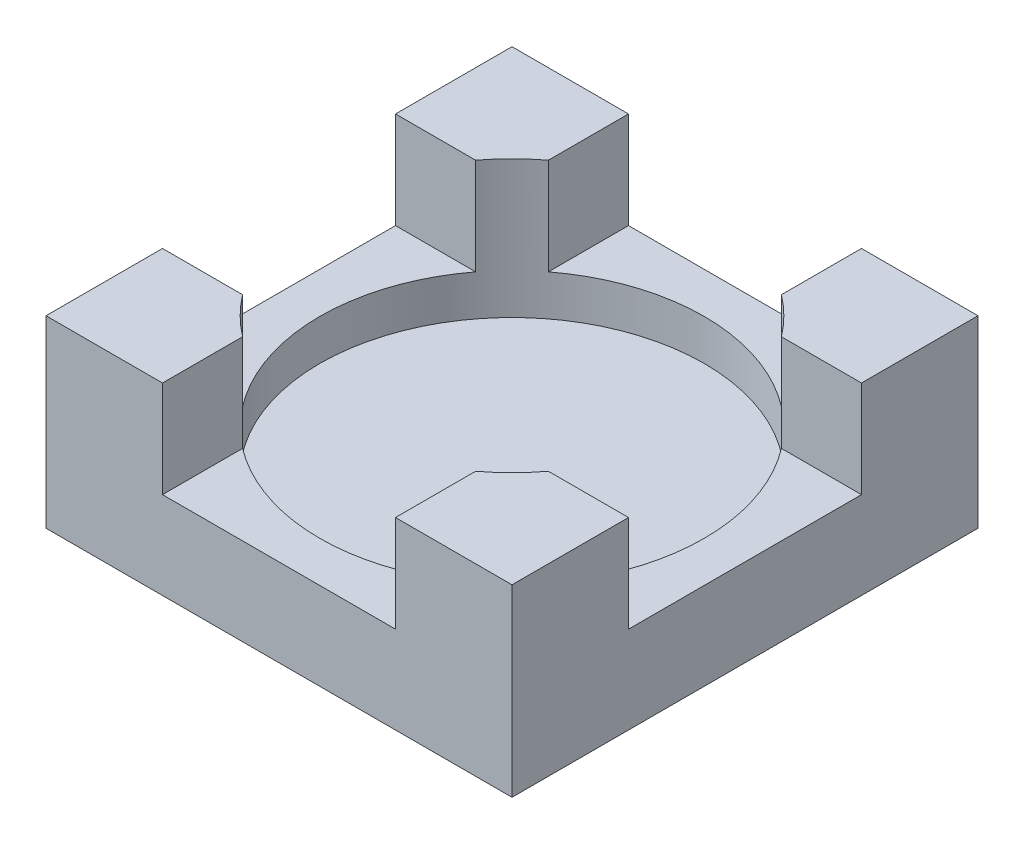
ISO-10303-21;
HEADER;
FILE_DESCRIPTION(('STEP AP214'),'2;1');
FILE_NAME('part.step','',(''),(''),'','','');
FILE_SCHEMA(('AUTOMOTIVE_DESIGN { 1 0 10303 214 1 1 1 1 }'));
ENDSEC;
DATA;
#1=APPLICATION_CONTEXT('core data for automotive mechanical design processes');
#2=APPLICATION_PROTOCOL_DEFINITION('international standard','automotive_design',2000,#1);
#3=PRODUCT_CONTEXT('',#1,'mechanical');
#4=PRODUCT('Part','Part','',(#3));
#5=PRODUCT_RELATED_PRODUCT_CATEGORY('part','',(#4));
#6=PRODUCT_DEFINITION_FORMATION('','',#4);
#7=PRODUCT_DEFINITION_CONTEXT('part definition',#1,'design');
#8=PRODUCT_DEFINITION('design','',#6,#7);
#9=PRODUCT_DEFINITION_SHAPE('','',#8);
#10=(LENGTH_UNIT() NAMED_UNIT(*) SI_UNIT(.MILLI.,.METRE.));
#11=(NAMED_UNIT(*) PLANE_ANGLE_UNIT() SI_UNIT($,.RADIAN.));
#12=(NAMED_UNIT(*) SI_UNIT($,.STERADIAN.) SOLID_ANGLE_UNIT());
#13=UNCERTAINTY_MEASURE_WITH_UNIT(LENGTH_MEASURE(1.E-05),#10,'distance_accuracy_value','');
#14=(GEOMETRIC_REPRESENTATION_CONTEXT(3) GLOBAL_UNCERTAINTY_ASSIGNED_CONTEXT((#13)) GLOBAL_UNIT_ASSIGNED_CONTEXT((#10,
#11,#12)) REPRESENTATION_CONTEXT('',''));
#15=CARTESIAN_POINT('',(0.,0.,0.));
#16=DIRECTION('',(0.,0.,1.));
#17=DIRECTION('',(1.,0.,0.));
#18=AXIS2_PLACEMENT_3D('',#15,#16,#17);
#19=CARTESIAN_POINT('',(0.,4.,0.));
#20=DIRECTION('',(0.,1.,0.));
#21=DIRECTION('',(0.,0.,1.));
#22=AXIS2_PLACEMENT_3D('',#19,#20,#21);
#23=CYLINDRICAL_SURFACE('',#22,16.5);
#24=DIRECTION('',(0.,1.,0.));
#25=VECTOR('',#24,1.);
#26=CARTESIAN_POINT('',(-10.,4.,-13.1244047484067));
#27=LINE('',#26,#25);
#28=CARTESIAN_POINT('',(-10.,15.8,-13.1244047484067));
#29=VERTEX_POINT('',#28);
#30=CARTESIAN_POINT('',(-10.,7.5,-13.1244047484067));
#31=VERTEX_POINT('',#30);
#32=EDGE_CURVE('E249',#29,#31,#27,.F.);
#33=ORIENTED_EDGE('',*,*,#32,.F.);
#34=CARTESIAN_POINT('',(0.,15.8,0.));
#35=DIRECTION('',(0.,-1.,0.));
#36=DIRECTION('',(0.,0.,-1.));
#37=AXIS2_PLACEMENT_3D('',#34,#35,#36);
#38=CIRCLE('',#37,16.5);
#39=CARTESIAN_POINT('',(-13.1244047484067,15.8,-10.));
#40=VERTEX_POINT('',#39);
#41=EDGE_CURVE('E365',#29,#40,#38,.F.);
#42=ORIENTED_EDGE('',*,*,#41,.T.);
#43=DIRECTION('',(0.,1.,0.));
#44=VECTOR('',#43,1.);
#45=CARTESIAN_POINT('',(-13.1244047484067,4.,-10.));
#46=LINE('',#45,#44);
#47=CARTESIAN_POINT('',(-13.1244047484067,7.5,-10.));
#48=VERTEX_POINT('',#47);
#49=EDGE_CURVE('E304',#48,#40,#46,.T.);
#50=ORIENTED_EDGE('',*,*,#49,.F.);
#51=CARTESIAN_POINT('',(0.,7.5,0.));
#52=DIRECTION('',(0.,-1.,0.));
#53=DIRECTION('',(0.,0.,-1.));
#54=AXIS2_PLACEMENT_3D('',#51,#52,#53);
#55=CIRCLE('',#54,16.5);
#56=CARTESIAN_POINT('',(-13.1244047484067,7.5,10.));
#57=VERTEX_POINT('',#56);
#58=EDGE_CURVE('E296',#48,#57,#55,.F.);
#59=ORIENTED_EDGE('',*,*,#58,.T.);
#60=DIRECTION('',(0.,1.,0.));
#61=VECTOR('',#60,1.);
#62=CARTESIAN_POINT('',(-13.1244047484067,4.,10.));
#63=LINE('',#62,#61);
#64=CARTESIAN_POINT('',(-13.1244047484067,15.8,10.));
#65=VERTEX_POINT('',#64);
#66=EDGE_CURVE('E292',#57,#65,#63,.T.);
#67=ORIENTED_EDGE('',*,*,#66,.T.);
#68=CARTESIAN_POINT('',(-10.,15.8,13.1244047484067));
#69=VERTEX_POINT('',#68);
#70=EDGE_CURVE('E358',#65,#69,#38,.F.);
#71=ORIENTED_EDGE('',*,*,#70,.T.);
#72=DIRECTION('',(0.,1.,0.));
#73=VECTOR('',#72,1.);
#74=CARTESIAN_POINT('',(-10.,4.,13.1244047484067));
#75=LINE('',#74,#73);
#76=CARTESIAN_POINT('',(-10.,7.5,13.1244047484067));
#77=VERTEX_POINT('',#76);
#78=EDGE_CURVE('E252',#77,#69,#75,.T.);
#79=ORIENTED_EDGE('',*,*,#78,.F.);
#80=CARTESIAN_POINT('',(0.,7.5,0.));
#81=DIRECTION('',(0.,-1.,0.));
#82=DIRECTION('',(1.,0.,0.));
#83=AXIS2_PLACEMENT_3D('',#80,#81,#82);
#84=CIRCLE('',#83,16.5);
#85=CARTESIAN_POINT('',(10.,7.5,13.1244047484067));
#86=VERTEX_POINT('',#85);
#87=EDGE_CURVE('E245',#77,#86,#84,.F.);
#88=ORIENTED_EDGE('',*,*,#87,.T.);
#89=DIRECTION('',(0.,1.,0.));
#90=VECTOR('',#89,1.);
#91=CARTESIAN_POINT('',(10.,4.,13.1244047484067));
#92=LINE('',#91,#90);
#93=CARTESIAN_POINT('',(10.,15.8,13.1244047484067));
#94=VERTEX_POINT('',#93);
#95=EDGE_CURVE('E240',#86,#94,#92,.T.);
#96=ORIENTED_EDGE('',*,*,#95,.T.);
#97=CARTESIAN_POINT('',(13.1244047484067,15.8,10.));
#98=VERTEX_POINT('',#97);
#99=EDGE_CURVE('E351',#94,#98,#38,.F.);
#100=ORIENTED_EDGE('',*,*,#99,.T.);
#101=DIRECTION('',(0.,1.,0.));
#102=VECTOR('',#101,1.);
#103=CARTESIAN_POINT('',(13.1244047484067,4.,10.));
#104=LINE('',#103,#102);
#105=CARTESIAN_POINT('',(13.1244047484067,7.5,10.));
#106=VERTEX_POINT('',#105);
#107=EDGE_CURVE('E279',#98,#106,#104,.F.);
#108=ORIENTED_EDGE('',*,*,#107,.T.);
#109=CARTESIAN_POINT('',(13.1244047484067,7.5,-10.));
#110=VERTEX_POINT('',#109);
#111=EDGE_CURVE('E297',#106,#110,#55,.F.);
#112=ORIENTED_EDGE('',*,*,#111,.T.);
#113=DIRECTION('',(0.,1.,0.));
#114=VECTOR('',#113,1.);
#115=CARTESIAN_POINT('',(13.1244047484067,4.,-10.));
#116=LINE('',#115,#114);
#117=CARTESIAN_POINT('',(13.1244047484067,15.8,-10.));
#118=VERTEX_POINT('',#117);
#119=EDGE_CURVE('E301',#118,#110,#116,.F.);
#120=ORIENTED_EDGE('',*,*,#119,.F.);
#121=CARTESIAN_POINT('',(10.,15.8,-13.1244047484067));
#122=VERTEX_POINT('',#121);
#123=EDGE_CURVE('E59',#118,#122,#38,.F.);
#124=ORIENTED_EDGE('',*,*,#123,.T.);
#125=DIRECTION('',(0.,1.,0.));
#126=VECTOR('',#125,1.);
#127=CARTESIAN_POINT('',(10.,4.,-13.1244047484067));
#128=LINE('',#127,#126);
#129=CARTESIAN_POINT('',(10.,7.5,-13.1244047484067));
#130=VERTEX_POINT('',#129);
#131=EDGE_CURVE('E237',#122,#130,#128,.F.);
#132=ORIENTED_EDGE('',*,*,#131,.T.);
#133=EDGE_CURVE('E244',#130,#31,#84,.F.);
#134=ORIENTED_EDGE('',*,*,#133,.T.);
#135=EDGE_LOOP('',(#33,#42,#50,#59,#67,#71,#79,#88,#96,#100,#108,#112,#120,#124,#132,#134));
#136=FACE_BOUND('',#135,.T.);
#137=CARTESIAN_POINT('',(0.,4.,0.));
#138=DIRECTION('',(0.,1.,0.));
#139=DIRECTION('',(0.,0.,1.));
#140=AXIS2_PLACEMENT_3D('',#137,#138,#139);
#141=CIRCLE('',#140,16.5);
#142=CARTESIAN_POINT('',(0.,4.,16.5));
#143=VERTEX_POINT('',#142);
#144=EDGE_CURVE('E233',#143,#143,#141,.T.);
#145=ORIENTED_EDGE('',*,*,#144,.F.);
#146=EDGE_LOOP('',(#145));
#147=FACE_BOUND('',#146,.T.);
#148=ADVANCED_FACE('F43',(#136,#147),#23,.F.);
#149=CARTESIAN_POINT('',(-20.,90.,20.));
#150=DIRECTION('',(1.,0.,0.));
#151=DIRECTION('',(0.,0.,-1.));
#152=AXIS2_PLACEMENT_3D('',#149,#150,#151);
#153=PLANE('',#152);
#154=DIRECTION('',(0.,-1.,0.));
#155=VECTOR('',#154,1.);
#156=CARTESIAN_POINT('',(-20.,90.,20.));
#157=LINE('',#156,#155);
#158=CARTESIAN_POINT('',(-20.0000000000001,15.8,20.));
#159=VERTEX_POINT('',#158);
#160=CARTESIAN_POINT('',(-20.,0.,20.));
#161=VERTEX_POINT('',#160);
#162=EDGE_CURVE('E211',#159,#161,#157,.T.);
#163=ORIENTED_EDGE('',*,*,#162,.F.);
#164=DIRECTION('',(0.,0.,1.));
#165=VECTOR('',#164,1.);
#166=CARTESIAN_POINT('',(-20.0000000000001,15.8,-20.));
#167=LINE('',#166,#165);
#168=CARTESIAN_POINT('',(-20.0000000000001,15.8,10.));
#169=VERTEX_POINT('',#168);
#170=EDGE_CURVE('E191',#169,#159,#167,.T.);
#171=ORIENTED_EDGE('',*,*,#170,.F.);
#172=DIRECTION('',(0.,1.,0.));
#173=VECTOR('',#172,1.);
#174=CARTESIAN_POINT('',(-20.,7.5,10.));
#175=LINE('',#174,#173);
#176=CARTESIAN_POINT('',(-20.,7.5,10.));
#177=VERTEX_POINT('',#176);
#178=EDGE_CURVE('E325',#177,#169,#175,.T.);
#179=ORIENTED_EDGE('',*,*,#178,.F.);
#180=DIRECTION('',(0.,0.,1.));
#181=VECTOR('',#180,1.);
#182=CARTESIAN_POINT('',(-20.,7.5,-10.));
#183=LINE('',#182,#181);
#184=CARTESIAN_POINT('',(-20.,7.5,-10.));
#185=VERTEX_POINT('',#184);
#186=EDGE_CURVE('E321',#185,#177,#183,.T.);
#187=ORIENTED_EDGE('',*,*,#186,.F.);
#188=DIRECTION('',(0.,1.,0.));
#189=VECTOR('',#188,1.);
#190=CARTESIAN_POINT('',(-20.,7.5,-10.));
#191=LINE('',#190,#189);
#192=CARTESIAN_POINT('',(-20.,15.8,-10.));
#193=VERTEX_POINT('',#192);
#194=EDGE_CURVE('E203',#185,#193,#191,.T.);
#195=ORIENTED_EDGE('',*,*,#194,.T.);
#196=CARTESIAN_POINT('',(-20.0000000000001,15.8,-20.));
#197=VERTEX_POINT('',#196);
#198=EDGE_CURVE('E182',#197,#193,#167,.T.);
#199=ORIENTED_EDGE('',*,*,#198,.F.);
#200=DIRECTION('',(0.,-1.,0.));
#201=VECTOR('',#200,1.);
#202=CARTESIAN_POINT('',(-20.,90.,-20.));
#203=LINE('',#202,#201);
#204=CARTESIAN_POINT('',(-20.,0.,-20.));
#205=VERTEX_POINT('',#204);
#206=EDGE_CURVE('E199',#197,#205,#203,.T.);
#207=ORIENTED_EDGE('',*,*,#206,.T.);
#208=DIRECTION('',(0.,0.,1.));
#209=VECTOR('',#208,1.);
#210=CARTESIAN_POINT('',(-20.,0.,20.));
#211=LINE('',#210,#209);
#212=EDGE_CURVE('E224',#205,#161,#211,.T.);
#213=ORIENTED_EDGE('',*,*,#212,.T.);
#214=EDGE_LOOP('',(#163,#171,#179,#187,#195,#199,#207,#213));
#215=FACE_BOUND('',#214,.T.);
#216=ADVANCED_FACE('F197',(#215),#153,.F.);
#217=CARTESIAN_POINT('',(20.,90.,20.));
#218=DIRECTION('',(-1.,0.,0.));
#219=DIRECTION('',(0.,0.,1.));
#220=AXIS2_PLACEMENT_3D('',#217,#218,#219);
#221=PLANE('',#220);
#222=DIRECTION('',(0.,-1.,0.));
#223=VECTOR('',#222,1.);
#224=CARTESIAN_POINT('',(20.,90.,-20.));
#225=LINE('',#224,#223);
#226=CARTESIAN_POINT('',(20.,15.8,-20.));
#227=VERTEX_POINT('',#226);
#228=CARTESIAN_POINT('',(20.,0.,-20.));
#229=VERTEX_POINT('',#228);
#230=EDGE_CURVE('E52',#227,#229,#225,.T.);
#231=ORIENTED_EDGE('',*,*,#230,.F.);
#232=DIRECTION('',(0.,0.,1.));
#233=VECTOR('',#232,1.);
#234=CARTESIAN_POINT('',(20.,15.8,-20.));
#235=LINE('',#234,#233);
#236=CARTESIAN_POINT('',(20.,15.8,-10.));
#237=VERTEX_POINT('',#236);
#238=EDGE_CURVE('E368',#227,#237,#235,.T.);
#239=ORIENTED_EDGE('',*,*,#238,.T.);
#240=DIRECTION('',(0.,1.,0.));
#241=VECTOR('',#240,1.);
#242=CARTESIAN_POINT('',(20.,7.5,-10.));
#243=LINE('',#242,#241);
#244=CARTESIAN_POINT('',(20.,7.50000000000001,-10.));
#245=VERTEX_POINT('',#244);
#246=EDGE_CURVE('E330',#245,#237,#243,.T.);
#247=ORIENTED_EDGE('',*,*,#246,.F.);
#248=DIRECTION('',(0.,0.,1.));
#249=VECTOR('',#248,1.);
#250=CARTESIAN_POINT('',(20.,7.5,-10.));
#251=LINE('',#250,#249);
#252=CARTESIAN_POINT('',(20.,7.5,10.));
#253=VERTEX_POINT('',#252);
#254=EDGE_CURVE('E334',#245,#253,#251,.T.);
#255=ORIENTED_EDGE('',*,*,#254,.T.);
#256=DIRECTION('',(0.,1.,0.));
#257=VECTOR('',#256,1.);
#258=CARTESIAN_POINT('',(20.,7.5,10.));
#259=LINE('',#258,#257);
#260=CARTESIAN_POINT('',(20.,15.8,10.));
#261=VERTEX_POINT('',#260);
#262=EDGE_CURVE('E320',#253,#261,#259,.T.);
#263=ORIENTED_EDGE('',*,*,#262,.T.);
#264=CARTESIAN_POINT('',(20.,15.8,20.));
#265=VERTEX_POINT('',#264);
#266=EDGE_CURVE('E67',#261,#265,#235,.T.);
#267=ORIENTED_EDGE('',*,*,#266,.T.);
#268=DIRECTION('',(0.,-1.,0.));
#269=VECTOR('',#268,1.);
#270=CARTESIAN_POINT('',(20.,90.,20.));
#271=LINE('',#270,#269);
#272=CARTESIAN_POINT('',(20.,0.,20.));
#273=VERTEX_POINT('',#272);
#274=EDGE_CURVE('E215',#265,#273,#271,.T.);
#275=ORIENTED_EDGE('',*,*,#274,.T.);
#276=DIRECTION('',(0.,0.,-1.));
#277=VECTOR('',#276,1.);
#278=CARTESIAN_POINT('',(20.,0.,20.));
#279=LINE('',#278,#277);
#280=EDGE_CURVE('E229',#273,#229,#279,.T.);
#281=ORIENTED_EDGE('',*,*,#280,.T.);
#282=EDGE_LOOP('',(#231,#239,#247,#255,#263,#267,#275,#281));
#283=FACE_BOUND('',#282,.T.);
#284=ADVANCED_FACE('F45',(#283),#221,.F.);
#285=CARTESIAN_POINT('',(-20.,90.,20.));
#286=DIRECTION('',(0.,0.,-1.));
#287=DIRECTION('',(-1.,0.,0.));
#288=AXIS2_PLACEMENT_3D('',#285,#286,#287);
#289=PLANE('',#288);
#290=ORIENTED_EDGE('',*,*,#274,.F.);
#291=DIRECTION('',(1.,0.,0.));
#292=VECTOR('',#291,1.);
#293=CARTESIAN_POINT('',(-20.0000000000001,15.8,20.));
#294=LINE('',#293,#292);
#295=CARTESIAN_POINT('',(10.,15.8,20.));
#296=VERTEX_POINT('',#295);
#297=EDGE_CURVE('E375',#296,#265,#294,.T.);
#298=ORIENTED_EDGE('',*,*,#297,.F.);
#299=DIRECTION('',(0.,1.,0.));
#300=VECTOR('',#299,1.);
#301=CARTESIAN_POINT('',(10.,7.5,20.));
#302=LINE('',#301,#300);
#303=CARTESIAN_POINT('',(10.,7.5,20.));
#304=VERTEX_POINT('',#303);
#305=EDGE_CURVE('E275',#304,#296,#302,.T.);
#306=ORIENTED_EDGE('',*,*,#305,.F.);
#307=DIRECTION('',(1.,0.,0.));
#308=VECTOR('',#307,1.);
#309=CARTESIAN_POINT('',(-10.,7.5,20.));
#310=LINE('',#309,#308);
#311=CARTESIAN_POINT('',(-10.,7.5,20.));
#312=VERTEX_POINT('',#311);
#313=EDGE_CURVE('E271',#312,#304,#310,.T.);
#314=ORIENTED_EDGE('',*,*,#313,.F.);
#315=DIRECTION('',(0.,1.,0.));
#316=VECTOR('',#315,1.);
#317=CARTESIAN_POINT('',(-10.,7.5,20.));
#318=LINE('',#317,#316);
#319=CARTESIAN_POINT('',(-10.,15.8,20.));
#320=VERTEX_POINT('',#319);
#321=EDGE_CURVE('E266',#312,#320,#318,.T.);
#322=ORIENTED_EDGE('',*,*,#321,.T.);
#323=EDGE_CURVE('E373',#159,#320,#294,.T.);
#324=ORIENTED_EDGE('',*,*,#323,.F.);
#325=ORIENTED_EDGE('',*,*,#162,.T.);
#326=DIRECTION('',(1.,0.,0.));
#327=VECTOR('',#326,1.);
#328=CARTESIAN_POINT('',(-20.,0.,20.));
#329=LINE('',#328,#327);
#330=EDGE_CURVE('E220',#161,#273,#329,.T.);
#331=ORIENTED_EDGE('',*,*,#330,.T.);
#332=EDGE_LOOP('',(#290,#298,#306,#314,#322,#324,#325,#331));
#333=FACE_BOUND('',#332,.T.);
#334=ADVANCED_FACE('F391',(#333),#289,.F.);
#335=CARTESIAN_POINT('',(-20.,90.,-20.));
#336=DIRECTION('',(0.,0.,1.));
#337=DIRECTION('',(1.,0.,0.));
#338=AXIS2_PLACEMENT_3D('',#335,#336,#337);
#339=PLANE('',#338);
#340=ORIENTED_EDGE('',*,*,#206,.F.);
#341=DIRECTION('',(1.,0.,0.));
#342=VECTOR('',#341,1.);
#343=CARTESIAN_POINT('',(-20.0000000000001,15.8,-20.));
#344=LINE('',#343,#342);
#345=CARTESIAN_POINT('',(-10.,15.8,-20.));
#346=VERTEX_POINT('',#345);
#347=EDGE_CURVE('E179',#197,#346,#344,.T.);
#348=ORIENTED_EDGE('',*,*,#347,.T.);
#349=DIRECTION('',(0.,1.,0.));
#350=VECTOR('',#349,1.);
#351=CARTESIAN_POINT('',(-10.,7.5,-20.));
#352=LINE('',#351,#350);
#353=CARTESIAN_POINT('',(-10.,7.50000000000001,-20.));
#354=VERTEX_POINT('',#353);
#355=EDGE_CURVE('E280',#354,#346,#352,.T.);
#356=ORIENTED_EDGE('',*,*,#355,.F.);
#357=DIRECTION('',(1.,0.,0.));
#358=VECTOR('',#357,1.);
#359=CARTESIAN_POINT('',(-10.,7.5,-20.));
#360=LINE('',#359,#358);
#361=CARTESIAN_POINT('',(10.,7.5,-20.));
#362=VERTEX_POINT('',#361);
#363=EDGE_CURVE('E283',#354,#362,#360,.T.);
#364=ORIENTED_EDGE('',*,*,#363,.T.);
#365=DIRECTION('',(0.,1.,0.));
#366=VECTOR('',#365,1.);
#367=CARTESIAN_POINT('',(10.,7.5,-20.));
#368=LINE('',#367,#366);
#369=CARTESIAN_POINT('',(10.,15.8,-20.));
#370=VERTEX_POINT('',#369);
#371=EDGE_CURVE('E270',#362,#370,#368,.T.);
#372=ORIENTED_EDGE('',*,*,#371,.T.);
#373=EDGE_CURVE('E192',#370,#227,#344,.T.);
#374=ORIENTED_EDGE('',*,*,#373,.T.);
#375=ORIENTED_EDGE('',*,*,#230,.T.);
#376=DIRECTION('',(-1.,0.,0.));
#377=VECTOR('',#376,1.);
#378=CARTESIAN_POINT('',(-20.,0.,-20.));
#379=LINE('',#378,#377);
#380=EDGE_CURVE('E208',#229,#205,#379,.T.);
#381=ORIENTED_EDGE('',*,*,#380,.T.);
#382=EDGE_LOOP('',(#340,#348,#356,#364,#372,#374,#375,#381));
#383=FACE_BOUND('',#382,.T.);
#384=ADVANCED_FACE('F206',(#383),#339,.F.);
#385=CARTESIAN_POINT('',(0.,4.,0.));
#386=DIRECTION('',(0.,1.,0.));
#387=DIRECTION('',(0.,0.,1.));
#388=AXIS2_PLACEMENT_3D('',#385,#386,#387);
#389=PLANE('',#388);
#390=ORIENTED_EDGE('',*,*,#144,.T.);
#391=EDGE_LOOP('',(#390));
#392=FACE_BOUND('',#391,.T.);
#393=ADVANCED_FACE('F452',(#392),#389,.T.);
#394=CARTESIAN_POINT('',(0.,0.,0.));
#395=DIRECTION('',(0.,-1.,0.));
#396=DIRECTION('',(0.,0.,-1.));
#397=AXIS2_PLACEMENT_3D('',#394,#395,#396);
#398=PLANE('',#397);
#399=ORIENTED_EDGE('',*,*,#280,.F.);
#400=ORIENTED_EDGE('',*,*,#330,.F.);
#401=ORIENTED_EDGE('',*,*,#212,.F.);
#402=ORIENTED_EDGE('',*,*,#380,.F.);
#403=EDGE_LOOP('',(#399,#400,#401,#402));
#404=FACE_BOUND('',#403,.T.);
#405=ADVANCED_FACE('F395',(#404),#398,.T.);
#406=CARTESIAN_POINT('',(-10.,7.5,-20.));
#407=DIRECTION('',(1.,0.,0.));
#408=DIRECTION('',(0.,0.,-1.));
#409=AXIS2_PLACEMENT_3D('',#406,#407,#408);
#410=PLANE('',#409);
#411=DIRECTION('',(0.,0.,-1.));
#412=VECTOR('',#411,1.);
#413=CARTESIAN_POINT('',(-10.,15.8,-20.));
#414=LINE('',#413,#412);
#415=EDGE_CURVE('E185',#29,#346,#414,.T.);
#416=ORIENTED_EDGE('',*,*,#415,.F.);
#417=ORIENTED_EDGE('',*,*,#32,.T.);
#418=DIRECTION('',(0.,0.,1.));
#419=VECTOR('',#418,1.);
#420=CARTESIAN_POINT('',(-10.,7.5,-20.));
#421=LINE('',#420,#419);
#422=EDGE_CURVE('E261',#354,#31,#421,.T.);
#423=ORIENTED_EDGE('',*,*,#422,.F.);
#424=ORIENTED_EDGE('',*,*,#355,.T.);
#425=EDGE_LOOP('',(#416,#417,#423,#424));
#426=FACE_BOUND('',#425,.T.);
#427=ADVANCED_FACE('F443',(#426),#410,.T.);
#428=CARTESIAN_POINT('',(-10.,7.5,-20.));
#429=DIRECTION('',(0.,-1.,0.));
#430=DIRECTION('',(1.,0.,0.));
#431=AXIS2_PLACEMENT_3D('',#428,#429,#430);
#432=PLANE('',#431);
#433=DIRECTION('',(0.,0.,1.));
#434=VECTOR('',#433,1.);
#435=CARTESIAN_POINT('',(10.,7.5,-20.));
#436=LINE('',#435,#434);
#437=EDGE_CURVE('E256',#362,#130,#436,.T.);
#438=ORIENTED_EDGE('',*,*,#437,.F.);
#439=ORIENTED_EDGE('',*,*,#363,.F.);
#440=ORIENTED_EDGE('',*,*,#422,.T.);
#441=ORIENTED_EDGE('',*,*,#133,.F.);
#442=EDGE_LOOP('',(#438,#439,#440,#441));
#443=FACE_BOUND('',#442,.T.);
#444=ADVANCED_FACE('F409',(#443),#432,.F.);
#445=CARTESIAN_POINT('',(10.,7.5,-20.));
#446=DIRECTION('',(1.,0.,0.));
#447=DIRECTION('',(0.,0.,-1.));
#448=AXIS2_PLACEMENT_3D('',#445,#446,#447);
#449=PLANE('',#448);
#450=ORIENTED_EDGE('',*,*,#131,.F.);
#451=DIRECTION('',(0.,0.,-1.));
#452=VECTOR('',#451,1.);
#453=CARTESIAN_POINT('',(10.,15.8,-20.));
#454=LINE('',#453,#452);
#455=EDGE_CURVE('E329',#122,#370,#454,.T.);
#456=ORIENTED_EDGE('',*,*,#455,.T.);
#457=ORIENTED_EDGE('',*,*,#371,.F.);
#458=ORIENTED_EDGE('',*,*,#437,.T.);
#459=EDGE_LOOP('',(#450,#456,#457,#458));
#460=FACE_BOUND('',#459,.T.);
#461=ADVANCED_FACE('F401',(#460),#449,.F.);
#462=ORIENTED_EDGE('',*,*,#305,.T.);
#463=DIRECTION('',(0.,0.,-1.));
#464=VECTOR('',#463,1.);
#465=CARTESIAN_POINT('',(10.,15.8,-20.));
#466=LINE('',#465,#464);
#467=EDGE_CURVE('E347',#296,#94,#466,.T.);
#468=ORIENTED_EDGE('',*,*,#467,.T.);
#469=ORIENTED_EDGE('',*,*,#95,.F.);
#470=EDGE_CURVE('E260',#86,#304,#436,.T.);
#471=ORIENTED_EDGE('',*,*,#470,.T.);
#472=EDGE_LOOP('',(#462,#468,#469,#471));
#473=FACE_BOUND('',#472,.T.);
#474=ADVANCED_FACE('F521',(#473),#449,.F.);
#475=EDGE_CURVE('E265',#77,#312,#421,.T.);
#476=ORIENTED_EDGE('',*,*,#475,.T.);
#477=ORIENTED_EDGE('',*,*,#313,.T.);
#478=ORIENTED_EDGE('',*,*,#470,.F.);
#479=ORIENTED_EDGE('',*,*,#87,.F.);
#480=EDGE_LOOP('',(#476,#477,#478,#479));
#481=FACE_BOUND('',#480,.T.);
#482=ADVANCED_FACE('F451',(#481),#432,.F.);
#483=DIRECTION('',(0.,0.,-1.));
#484=VECTOR('',#483,1.);
#485=CARTESIAN_POINT('',(-10.,15.8,-20.));
#486=LINE('',#485,#484);
#487=EDGE_CURVE('E355',#320,#69,#486,.T.);
#488=ORIENTED_EDGE('',*,*,#487,.F.);
#489=ORIENTED_EDGE('',*,*,#321,.F.);
#490=ORIENTED_EDGE('',*,*,#475,.F.);
#491=ORIENTED_EDGE('',*,*,#78,.T.);
#492=EDGE_LOOP('',(#488,#489,#490,#491));
#493=FACE_BOUND('',#492,.T.);
#494=ADVANCED_FACE('F430',(#493),#410,.T.);
#495=CARTESIAN_POINT('',(20.,7.5,-10.));
#496=DIRECTION('',(0.,0.,1.));
#497=DIRECTION('',(1.,0.,0.));
#498=AXIS2_PLACEMENT_3D('',#495,#496,#497);
#499=PLANE('',#498);
#500=DIRECTION('',(1.,0.,0.));
#501=VECTOR('',#500,1.);
#502=CARTESIAN_POINT('',(20.,15.8,-10.));
#503=LINE('',#502,#501);
#504=EDGE_CURVE('E344',#118,#237,#503,.T.);
#505=ORIENTED_EDGE('',*,*,#504,.F.);
#506=ORIENTED_EDGE('',*,*,#119,.T.);
#507=DIRECTION('',(-1.,0.,0.));
#508=VECTOR('',#507,1.);
#509=CARTESIAN_POINT('',(20.,7.5,-10.));
#510=LINE('',#509,#508);
#511=EDGE_CURVE('E313',#245,#110,#510,.T.);
#512=ORIENTED_EDGE('',*,*,#511,.F.);
#513=ORIENTED_EDGE('',*,*,#246,.T.);
#514=EDGE_LOOP('',(#505,#506,#512,#513));
#515=FACE_BOUND('',#514,.T.);
#516=ADVANCED_FACE('F456',(#515),#499,.T.);
#517=CARTESIAN_POINT('',(20.,7.5,-10.));
#518=DIRECTION('',(0.,-1.,0.));
#519=DIRECTION('',(0.,0.,-1.));
#520=AXIS2_PLACEMENT_3D('',#517,#518,#519);
#521=PLANE('',#520);
#522=DIRECTION('',(-1.,0.,0.));
#523=VECTOR('',#522,1.);
#524=CARTESIAN_POINT('',(20.,7.5,10.));
#525=LINE('',#524,#523);
#526=EDGE_CURVE('E308',#253,#106,#525,.T.);
#527=ORIENTED_EDGE('',*,*,#526,.F.);
#528=ORIENTED_EDGE('',*,*,#254,.F.);
#529=ORIENTED_EDGE('',*,*,#511,.T.);
#530=ORIENTED_EDGE('',*,*,#111,.F.);
#531=EDGE_LOOP('',(#527,#528,#529,#530));
#532=FACE_BOUND('',#531,.T.);
#533=ADVANCED_FACE('F575',(#532),#521,.F.);
#534=CARTESIAN_POINT('',(20.,7.5,10.));
#535=DIRECTION('',(0.,0.,1.));
#536=DIRECTION('',(1.,0.,0.));
#537=AXIS2_PLACEMENT_3D('',#534,#535,#536);
#538=PLANE('',#537);
#539=ORIENTED_EDGE('',*,*,#107,.F.);
#540=DIRECTION('',(1.,0.,0.));
#541=VECTOR('',#540,1.);
#542=CARTESIAN_POINT('',(20.,15.8,10.));
#543=LINE('',#542,#541);
#544=EDGE_CURVE('E352',#98,#261,#543,.T.);
#545=ORIENTED_EDGE('',*,*,#544,.T.);
#546=ORIENTED_EDGE('',*,*,#262,.F.);
#547=ORIENTED_EDGE('',*,*,#526,.T.);
#548=EDGE_LOOP('',(#539,#545,#546,#547));
#549=FACE_BOUND('',#548,.T.);
#550=ADVANCED_FACE('F586',(#549),#538,.F.);
#551=ORIENTED_EDGE('',*,*,#178,.T.);
#552=DIRECTION('',(1.,0.,0.));
#553=VECTOR('',#552,1.);
#554=CARTESIAN_POINT('',(20.,15.8,10.));
#555=LINE('',#554,#553);
#556=EDGE_CURVE('E359',#169,#65,#555,.T.);
#557=ORIENTED_EDGE('',*,*,#556,.T.);
#558=ORIENTED_EDGE('',*,*,#66,.F.);
#559=EDGE_CURVE('E312',#57,#177,#525,.T.);
#560=ORIENTED_EDGE('',*,*,#559,.T.);
#561=EDGE_LOOP('',(#551,#557,#558,#560));
#562=FACE_BOUND('',#561,.T.);
#563=ADVANCED_FACE('F437',(#562),#538,.F.);
#564=EDGE_CURVE('E317',#48,#185,#510,.T.);
#565=ORIENTED_EDGE('',*,*,#564,.T.);
#566=ORIENTED_EDGE('',*,*,#186,.T.);
#567=ORIENTED_EDGE('',*,*,#559,.F.);
#568=ORIENTED_EDGE('',*,*,#58,.F.);
#569=EDGE_LOOP('',(#565,#566,#567,#568));
#570=FACE_BOUND('',#569,.T.);
#571=ADVANCED_FACE('F439',(#570),#521,.F.);
#572=DIRECTION('',(1.,0.,0.));
#573=VECTOR('',#572,1.);
#574=CARTESIAN_POINT('',(20.,15.8,-10.));
#575=LINE('',#574,#573);
#576=EDGE_CURVE('E11',#193,#40,#575,.T.);
#577=ORIENTED_EDGE('',*,*,#576,.F.);
#578=ORIENTED_EDGE('',*,*,#194,.F.);
#579=ORIENTED_EDGE('',*,*,#564,.F.);
#580=ORIENTED_EDGE('',*,*,#49,.T.);
#581=EDGE_LOOP('',(#577,#578,#579,#580));
#582=FACE_BOUND('',#581,.T.);
#583=ADVANCED_FACE('F441',(#582),#499,.T.);
#584=CARTESIAN_POINT('',(-20.0000000000001,15.8,-20.));
#585=DIRECTION('',(0.,-1.,0.));
#586=DIRECTION('',(0.,0.,-1.));
#587=AXIS2_PLACEMENT_3D('',#584,#585,#586);
#588=PLANE('',#587);
#589=ORIENTED_EDGE('',*,*,#415,.T.);
#590=ORIENTED_EDGE('',*,*,#347,.F.);
#591=ORIENTED_EDGE('',*,*,#198,.T.);
#592=ORIENTED_EDGE('',*,*,#576,.T.);
#593=ORIENTED_EDGE('',*,*,#41,.F.);
#594=EDGE_LOOP('',(#589,#590,#591,#592,#593));
#595=FACE_BOUND('',#594,.T.);
#596=ADVANCED_FACE('F181',(#595),#588,.F.);
#597=ORIENTED_EDGE('',*,*,#487,.T.);
#598=ORIENTED_EDGE('',*,*,#70,.F.);
#599=ORIENTED_EDGE('',*,*,#556,.F.);
#600=ORIENTED_EDGE('',*,*,#170,.T.);
#601=ORIENTED_EDGE('',*,*,#323,.T.);
#602=EDGE_LOOP('',(#597,#598,#599,#600,#601));
#603=FACE_BOUND('',#602,.T.);
#604=ADVANCED_FACE('F425',(#603),#588,.F.);
#605=ORIENTED_EDGE('',*,*,#297,.T.);
#606=ORIENTED_EDGE('',*,*,#266,.F.);
#607=ORIENTED_EDGE('',*,*,#544,.F.);
#608=ORIENTED_EDGE('',*,*,#99,.F.);
#609=ORIENTED_EDGE('',*,*,#467,.F.);
#610=EDGE_LOOP('',(#605,#606,#607,#608,#609));
#611=FACE_BOUND('',#610,.T.);
#612=ADVANCED_FACE('F383',(#611),#588,.F.);
#613=ORIENTED_EDGE('',*,*,#123,.F.);
#614=ORIENTED_EDGE('',*,*,#504,.T.);
#615=ORIENTED_EDGE('',*,*,#238,.F.);
#616=ORIENTED_EDGE('',*,*,#373,.F.);
#617=ORIENTED_EDGE('',*,*,#455,.F.);
#618=EDGE_LOOP('',(#613,#614,#615,#616,#617));
#619=FACE_BOUND('',#618,.T.);
#620=ADVANCED_FACE('F398',(#619),#588,.F.);
#621=CLOSED_SHELL('',(#148,#216,#284,#334,#384,#393,#405,#427,#444,#461,#474,#482,#494,#516,
#533,#550,#563,#571,#583,#596,#604,#612,#620));
#622=MANIFOLD_SOLID_BREP('B2',#621);
#623=ADVANCED_BREP_SHAPE_REPRESENTATION('',(#18,#622),#14);
#624=SHAPE_DEFINITION_REPRESENTATION(#9,#623);
ENDSEC;
END-ISO-10303-21;
